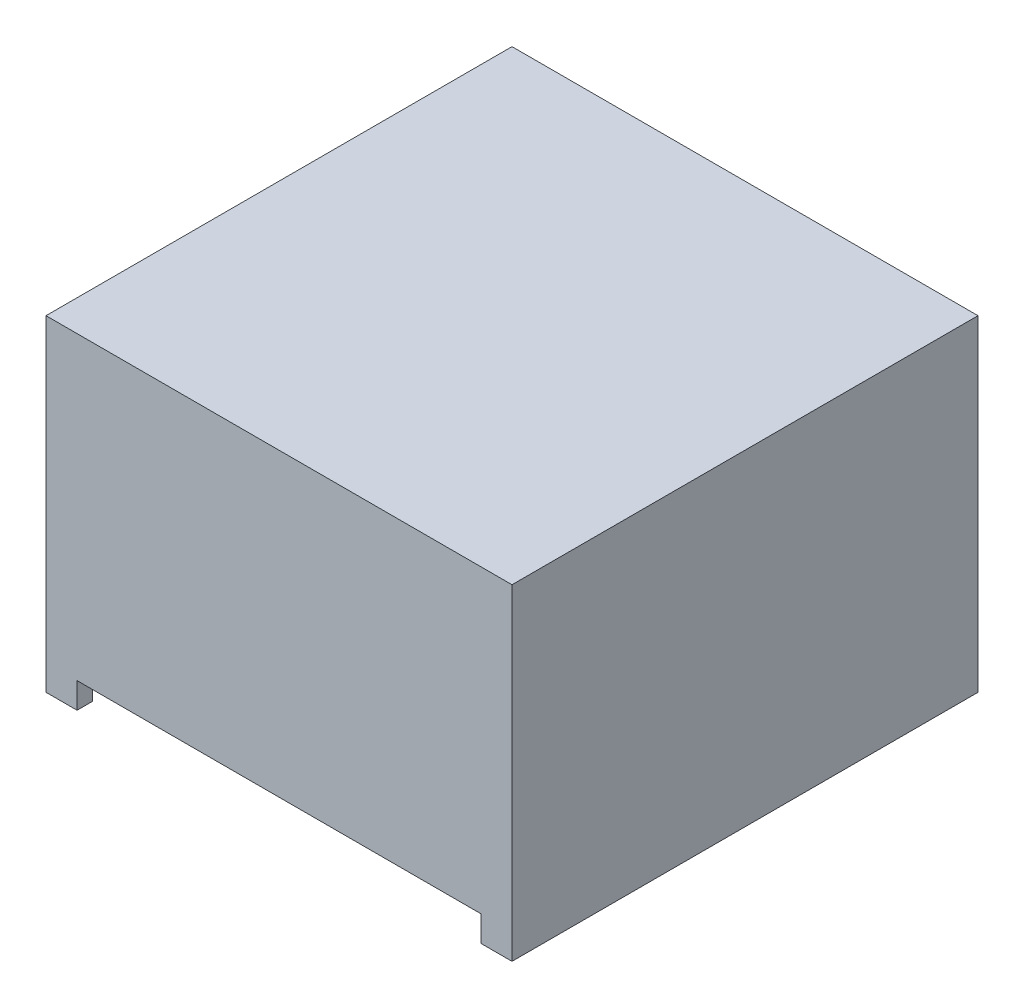
ISO-10303-21;
HEADER;
FILE_DESCRIPTION(('STEP AP214'),'2;1');
FILE_NAME('part.step','',(''),(''),'','','');
FILE_SCHEMA(('AUTOMOTIVE_DESIGN { 1 0 10303 214 1 1 1 1 }'));
ENDSEC;
DATA;
#1=APPLICATION_CONTEXT('core data for automotive mechanical design processes');
#2=APPLICATION_PROTOCOL_DEFINITION('international standard','automotive_design',2000,#1);
#3=PRODUCT_CONTEXT('',#1,'mechanical');
#4=PRODUCT('Part','Part','',(#3));
#5=PRODUCT_RELATED_PRODUCT_CATEGORY('part','',(#4));
#6=PRODUCT_DEFINITION_FORMATION('','',#4);
#7=PRODUCT_DEFINITION_CONTEXT('part definition',#1,'design');
#8=PRODUCT_DEFINITION('design','',#6,#7);
#9=PRODUCT_DEFINITION_SHAPE('','',#8);
#10=(LENGTH_UNIT() NAMED_UNIT(*) SI_UNIT(.MILLI.,.METRE.));
#11=(NAMED_UNIT(*) PLANE_ANGLE_UNIT() SI_UNIT($,.RADIAN.));
#12=(NAMED_UNIT(*) SI_UNIT($,.STERADIAN.) SOLID_ANGLE_UNIT());
#13=UNCERTAINTY_MEASURE_WITH_UNIT(LENGTH_MEASURE(1.E-05),#10,'distance_accuracy_value','');
#14=(GEOMETRIC_REPRESENTATION_CONTEXT(3) GLOBAL_UNCERTAINTY_ASSIGNED_CONTEXT((#13)) GLOBAL_UNIT_ASSIGNED_CONTEXT((#10,
#11,#12)) REPRESENTATION_CONTEXT('',''));
#15=CARTESIAN_POINT('',(0.,0.,0.));
#16=DIRECTION('',(0.,0.,1.));
#17=DIRECTION('',(1.,0.,0.));
#18=AXIS2_PLACEMENT_3D('',#15,#16,#17);
#19=CARTESIAN_POINT('',(0.,5.,0.));
#20=DIRECTION('',(1.,0.,0.));
#21=DIRECTION('',(0.,0.,-1.));
#22=AXIS2_PLACEMENT_3D('',#19,#20,#21);
#23=PLANE('',#22);
#24=DIRECTION('',(0.,-1.,0.));
#25=VECTOR('',#24,1.);
#26=CARTESIAN_POINT('',(0.,5.,150.));
#27=LINE('',#26,#25);
#28=CARTESIAN_POINT('',(0.,5.,150.));
#29=VERTEX_POINT('',#28);
#30=CARTESIAN_POINT('',(0.,-100.,150.));
#31=VERTEX_POINT('',#30);
#32=EDGE_CURVE('E38',#29,#31,#27,.T.);
#33=ORIENTED_EDGE('',*,*,#32,.T.);
#34=DIRECTION('',(0.,0.,-1.));
#35=VECTOR('',#34,1.);
#36=CARTESIAN_POINT('',(0.,-100.,0.));
#37=LINE('',#36,#35);
#38=CARTESIAN_POINT('',(0.,-100.,0.));
#39=VERTEX_POINT('',#38);
#40=EDGE_CURVE('E170',#31,#39,#37,.T.);
#41=ORIENTED_EDGE('',*,*,#40,.T.);
#42=DIRECTION('',(0.,-1.,0.));
#43=VECTOR('',#42,1.);
#44=CARTESIAN_POINT('',(0.,5.,0.));
#45=LINE('',#44,#43);
#46=CARTESIAN_POINT('',(0.,5.,0.));
#47=VERTEX_POINT('',#46);
#48=EDGE_CURVE('E11',#47,#39,#45,.T.);
#49=ORIENTED_EDGE('',*,*,#48,.F.);
#50=DIRECTION('',(0.,0.,1.));
#51=VECTOR('',#50,1.);
#52=CARTESIAN_POINT('',(0.,5.,0.));
#53=LINE('',#52,#51);
#54=EDGE_CURVE('E185',#47,#29,#53,.T.);
#55=ORIENTED_EDGE('',*,*,#54,.T.);
#56=EDGE_LOOP('',(#33,#41,#49,#55));
#57=FACE_BOUND('',#56,.T.);
#58=ADVANCED_FACE('F35',(#57),#23,.T.);
#59=CARTESIAN_POINT('',(0.,5.,0.));
#60=DIRECTION('',(0.,0.,1.));
#61=DIRECTION('',(1.,0.,0.));
#62=AXIS2_PLACEMENT_3D('',#59,#60,#61);
#63=PLANE('',#62);
#64=ORIENTED_EDGE('',*,*,#48,.T.);
#65=DIRECTION('',(-1.,0.,0.));
#66=VECTOR('',#65,1.);
#67=CARTESIAN_POINT('',(0.,-100.,0.));
#68=LINE('',#67,#66);
#69=CARTESIAN_POINT('',(-150.,-100.,0.));
#70=VERTEX_POINT('',#69);
#71=EDGE_CURVE('E176',#39,#70,#68,.T.);
#72=ORIENTED_EDGE('',*,*,#71,.T.);
#73=DIRECTION('',(0.,-1.,0.));
#74=VECTOR('',#73,1.);
#75=CARTESIAN_POINT('',(-150.,5.,0.));
#76=LINE('',#75,#74);
#77=CARTESIAN_POINT('',(-150.,5.,0.));
#78=VERTEX_POINT('',#77);
#79=EDGE_CURVE('E43',#78,#70,#76,.T.);
#80=ORIENTED_EDGE('',*,*,#79,.F.);
#81=DIRECTION('',(-1.,0.,0.));
#82=VECTOR('',#81,1.);
#83=CARTESIAN_POINT('',(0.,5.,0.));
#84=LINE('',#83,#82);
#85=EDGE_CURVE('E193',#47,#78,#84,.T.);
#86=ORIENTED_EDGE('',*,*,#85,.F.);
#87=EDGE_LOOP('',(#64,#72,#80,#86));
#88=FACE_BOUND('',#87,.T.);
#89=ADVANCED_FACE('F209',(#88),#63,.F.);
#90=CARTESIAN_POINT('',(-150.,5.,0.));
#91=DIRECTION('',(1.,0.,0.));
#92=DIRECTION('',(0.,0.,-1.));
#93=AXIS2_PLACEMENT_3D('',#90,#91,#92);
#94=PLANE('',#93);
#95=ORIENTED_EDGE('',*,*,#79,.T.);
#96=DIRECTION('',(0.,0.,1.));
#97=VECTOR('',#96,1.);
#98=CARTESIAN_POINT('',(-150.,-100.,0.));
#99=LINE('',#98,#97);
#100=CARTESIAN_POINT('',(-150.,-100.,150.));
#101=VERTEX_POINT('',#100);
#102=EDGE_CURVE('E179',#70,#101,#99,.T.);
#103=ORIENTED_EDGE('',*,*,#102,.T.);
#104=DIRECTION('',(0.,-1.,0.));
#105=VECTOR('',#104,1.);
#106=CARTESIAN_POINT('',(-150.,5.,150.));
#107=LINE('',#106,#105);
#108=CARTESIAN_POINT('',(-150.,5.,150.));
#109=VERTEX_POINT('',#108);
#110=EDGE_CURVE('E195',#109,#101,#107,.T.);
#111=ORIENTED_EDGE('',*,*,#110,.F.);
#112=DIRECTION('',(0.,0.,1.));
#113=VECTOR('',#112,1.);
#114=CARTESIAN_POINT('',(-150.,5.,0.));
#115=LINE('',#114,#113);
#116=EDGE_CURVE('E191',#78,#109,#115,.T.);
#117=ORIENTED_EDGE('',*,*,#116,.F.);
#118=EDGE_LOOP('',(#95,#103,#111,#117));
#119=FACE_BOUND('',#118,.T.);
#120=ADVANCED_FACE('F217',(#119),#94,.F.);
#121=CARTESIAN_POINT('',(0.,5.,150.));
#122=DIRECTION('',(0.,0.,1.));
#123=DIRECTION('',(1.,0.,0.));
#124=AXIS2_PLACEMENT_3D('',#121,#122,#123);
#125=PLANE('',#124);
#126=DIRECTION('',(0.,-1.,0.));
#127=VECTOR('',#126,1.);
#128=CARTESIAN_POINT('',(-140.,-100.,150.));
#129=LINE('',#128,#127);
#130=CARTESIAN_POINT('',(-140.,-91.7339563952613,150.));
#131=VERTEX_POINT('',#130);
#132=CARTESIAN_POINT('',(-140.,-100.,150.));
#133=VERTEX_POINT('',#132);
#134=EDGE_CURVE('E130',#131,#133,#129,.T.);
#135=ORIENTED_EDGE('',*,*,#134,.F.);
#136=DIRECTION('',(-1.,0.,0.));
#137=VECTOR('',#136,1.);
#138=CARTESIAN_POINT('',(-140.,-91.7339563952613,150.));
#139=LINE('',#138,#137);
#140=CARTESIAN_POINT('',(-10.,-91.7339563952613,150.));
#141=VERTEX_POINT('',#140);
#142=EDGE_CURVE('E144',#141,#131,#139,.T.);
#143=ORIENTED_EDGE('',*,*,#142,.F.);
#144=DIRECTION('',(0.,1.,0.));
#145=VECTOR('',#144,1.);
#146=CARTESIAN_POINT('',(-10.,-100.,150.));
#147=LINE('',#146,#145);
#148=CARTESIAN_POINT('',(-10.,-100.,150.));
#149=VERTEX_POINT('',#148);
#150=EDGE_CURVE('E266',#149,#141,#147,.T.);
#151=ORIENTED_EDGE('',*,*,#150,.F.);
#152=DIRECTION('',(1.,0.,0.));
#153=VECTOR('',#152,1.);
#154=CARTESIAN_POINT('',(0.,-100.,150.));
#155=LINE('',#154,#153);
#156=EDGE_CURVE('E182',#149,#31,#155,.T.);
#157=ORIENTED_EDGE('',*,*,#156,.T.);
#158=ORIENTED_EDGE('',*,*,#32,.F.);
#159=DIRECTION('',(-1.,0.,0.));
#160=VECTOR('',#159,1.);
#161=CARTESIAN_POINT('',(0.,5.,150.));
#162=LINE('',#161,#160);
#163=EDGE_CURVE('E188',#29,#109,#162,.T.);
#164=ORIENTED_EDGE('',*,*,#163,.T.);
#165=ORIENTED_EDGE('',*,*,#110,.T.);
#166=EDGE_CURVE('E183',#101,#133,#155,.T.);
#167=ORIENTED_EDGE('',*,*,#166,.T.);
#168=EDGE_LOOP('',(#135,#143,#151,#157,#158,#164,#165,#167));
#169=FACE_BOUND('',#168,.T.);
#170=ADVANCED_FACE('F214',(#169),#125,.T.);
#171=CARTESIAN_POINT('',(0.,5.,0.));
#172=DIRECTION('',(0.,-1.,0.));
#173=DIRECTION('',(0.,0.,-1.));
#174=AXIS2_PLACEMENT_3D('',#171,#172,#173);
#175=PLANE('',#174);
#176=ORIENTED_EDGE('',*,*,#54,.F.);
#177=ORIENTED_EDGE('',*,*,#85,.T.);
#178=ORIENTED_EDGE('',*,*,#116,.T.);
#179=ORIENTED_EDGE('',*,*,#163,.F.);
#180=EDGE_LOOP('',(#176,#177,#178,#179));
#181=FACE_BOUND('',#180,.T.);
#182=ADVANCED_FACE('F213',(#181),#175,.F.);
#183=CARTESIAN_POINT('',(0.,-100.,0.));
#184=DIRECTION('',(0.,-1.,0.));
#185=DIRECTION('',(0.,0.,-1.));
#186=AXIS2_PLACEMENT_3D('',#183,#184,#185);
#187=PLANE('',#186);
#188=DIRECTION('',(0.,0.,1.));
#189=VECTOR('',#188,1.);
#190=CARTESIAN_POINT('',(-140.,-100.,145.));
#191=LINE('',#190,#189);
#192=CARTESIAN_POINT('',(-140.,-100.,145.));
#193=VERTEX_POINT('',#192);
#194=EDGE_CURVE('E125',#193,#133,#191,.T.);
#195=ORIENTED_EDGE('',*,*,#194,.T.);
#196=ORIENTED_EDGE('',*,*,#166,.F.);
#197=ORIENTED_EDGE('',*,*,#102,.F.);
#198=ORIENTED_EDGE('',*,*,#71,.F.);
#199=ORIENTED_EDGE('',*,*,#40,.F.);
#200=ORIENTED_EDGE('',*,*,#156,.F.);
#201=DIRECTION('',(0.,0.,1.));
#202=VECTOR('',#201,1.);
#203=CARTESIAN_POINT('',(-10.,-100.,145.));
#204=LINE('',#203,#202);
#205=CARTESIAN_POINT('',(-10.,-100.,145.));
#206=VERTEX_POINT('',#205);
#207=EDGE_CURVE('E135',#206,#149,#204,.T.);
#208=ORIENTED_EDGE('',*,*,#207,.F.);
#209=DIRECTION('',(1.,0.,0.));
#210=VECTOR('',#209,1.);
#211=CARTESIAN_POINT('',(-4.99999999999998,-100.,145.));
#212=LINE('',#211,#210);
#213=CARTESIAN_POINT('',(-4.99999999999998,-100.,145.));
#214=VERTEX_POINT('',#213);
#215=EDGE_CURVE('E149',#206,#214,#212,.T.);
#216=ORIENTED_EDGE('',*,*,#215,.T.);
#217=DIRECTION('',(0.,0.,-1.));
#218=VECTOR('',#217,1.);
#219=CARTESIAN_POINT('',(-5.,-100.,5.));
#220=LINE('',#219,#218);
#221=CARTESIAN_POINT('',(-5.,-100.,5.));
#222=VERTEX_POINT('',#221);
#223=EDGE_CURVE('E167',#214,#222,#220,.T.);
#224=ORIENTED_EDGE('',*,*,#223,.T.);
#225=DIRECTION('',(-1.,0.,0.));
#226=VECTOR('',#225,1.);
#227=CARTESIAN_POINT('',(-5.,-100.,5.));
#228=LINE('',#227,#226);
#229=CARTESIAN_POINT('',(-145.,-100.,5.00000000000002));
#230=VERTEX_POINT('',#229);
#231=EDGE_CURVE('E275',#222,#230,#228,.T.);
#232=ORIENTED_EDGE('',*,*,#231,.T.);
#233=DIRECTION('',(0.,0.,1.));
#234=VECTOR('',#233,1.);
#235=CARTESIAN_POINT('',(-145.,-100.,5.00000000000002));
#236=LINE('',#235,#234);
#237=CARTESIAN_POINT('',(-145.,-100.,145.));
#238=VERTEX_POINT('',#237);
#239=EDGE_CURVE('E148',#230,#238,#236,.T.);
#240=ORIENTED_EDGE('',*,*,#239,.T.);
#241=EDGE_CURVE('E140',#238,#193,#212,.T.);
#242=ORIENTED_EDGE('',*,*,#241,.T.);
#243=EDGE_LOOP('',(#195,#196,#197,#198,#199,#200,#208,#216,#224,#232,#240,#242));
#244=FACE_BOUND('',#243,.T.);
#245=ADVANCED_FACE('F146',(#244),#187,.T.);
#246=CARTESIAN_POINT('',(-5.,-100.,5.));
#247=DIRECTION('',(1.,0.,0.));
#248=DIRECTION('',(0.,0.,-1.));
#249=AXIS2_PLACEMENT_3D('',#246,#247,#248);
#250=PLANE('',#249);
#251=DIRECTION('',(0.,0.,-1.));
#252=VECTOR('',#251,1.);
#253=CARTESIAN_POINT('',(-5.,0.,5.));
#254=LINE('',#253,#252);
#255=CARTESIAN_POINT('',(-4.99999999999998,0.,145.));
#256=VERTEX_POINT('',#255);
#257=CARTESIAN_POINT('',(-5.,0.,5.));
#258=VERTEX_POINT('',#257);
#259=EDGE_CURVE('E156',#256,#258,#254,.T.);
#260=ORIENTED_EDGE('',*,*,#259,.T.);
#261=DIRECTION('',(0.,1.,0.));
#262=VECTOR('',#261,1.);
#263=CARTESIAN_POINT('',(-5.,-100.,5.));
#264=LINE('',#263,#262);
#265=EDGE_CURVE('E59',#222,#258,#264,.T.);
#266=ORIENTED_EDGE('',*,*,#265,.F.);
#267=ORIENTED_EDGE('',*,*,#223,.F.);
#268=DIRECTION('',(0.,1.,0.));
#269=VECTOR('',#268,1.);
#270=CARTESIAN_POINT('',(-4.99999999999998,-100.,145.));
#271=LINE('',#270,#269);
#272=EDGE_CURVE('E168',#214,#256,#271,.T.);
#273=ORIENTED_EDGE('',*,*,#272,.T.);
#274=EDGE_LOOP('',(#260,#266,#267,#273));
#275=FACE_BOUND('',#274,.T.);
#276=ADVANCED_FACE('F240',(#275),#250,.F.);
#277=CARTESIAN_POINT('',(-4.99999999999998,-100.,145.));
#278=DIRECTION('',(0.,0.,1.));
#279=DIRECTION('',(1.,0.,0.));
#280=AXIS2_PLACEMENT_3D('',#277,#278,#279);
#281=PLANE('',#280);
#282=DIRECTION('',(-1.,0.,0.));
#283=VECTOR('',#282,1.);
#284=CARTESIAN_POINT('',(-140.,-91.7339563952613,145.));
#285=LINE('',#284,#283);
#286=CARTESIAN_POINT('',(-10.,-91.7339563952613,145.));
#287=VERTEX_POINT('',#286);
#288=CARTESIAN_POINT('',(-140.,-91.7339563952613,145.));
#289=VERTEX_POINT('',#288);
#290=EDGE_CURVE('E51',#287,#289,#285,.T.);
#291=ORIENTED_EDGE('',*,*,#290,.T.);
#292=DIRECTION('',(0.,-1.,0.));
#293=VECTOR('',#292,1.);
#294=CARTESIAN_POINT('',(-140.,-100.,145.));
#295=LINE('',#294,#293);
#296=EDGE_CURVE('E128',#289,#193,#295,.T.);
#297=ORIENTED_EDGE('',*,*,#296,.T.);
#298=ORIENTED_EDGE('',*,*,#241,.F.);
#299=DIRECTION('',(0.,1.,0.));
#300=VECTOR('',#299,1.);
#301=CARTESIAN_POINT('',(-145.,-100.,145.));
#302=LINE('',#301,#300);
#303=CARTESIAN_POINT('',(-145.,0.,145.));
#304=VERTEX_POINT('',#303);
#305=EDGE_CURVE('E171',#238,#304,#302,.T.);
#306=ORIENTED_EDGE('',*,*,#305,.T.);
#307=DIRECTION('',(1.,0.,0.));
#308=VECTOR('',#307,1.);
#309=CARTESIAN_POINT('',(-4.99999999999998,0.,145.));
#310=LINE('',#309,#308);
#311=EDGE_CURVE('E164',#304,#256,#310,.T.);
#312=ORIENTED_EDGE('',*,*,#311,.T.);
#313=ORIENTED_EDGE('',*,*,#272,.F.);
#314=ORIENTED_EDGE('',*,*,#215,.F.);
#315=DIRECTION('',(0.,1.,0.));
#316=VECTOR('',#315,1.);
#317=CARTESIAN_POINT('',(-10.,-100.,145.));
#318=LINE('',#317,#316);
#319=EDGE_CURVE('E143',#206,#287,#318,.T.);
#320=ORIENTED_EDGE('',*,*,#319,.T.);
#321=EDGE_LOOP('',(#291,#297,#298,#306,#312,#313,#314,#320));
#322=FACE_BOUND('',#321,.T.);
#323=ADVANCED_FACE('F139',(#322),#281,.F.);
#324=CARTESIAN_POINT('',(-145.,-100.,5.00000000000002));
#325=DIRECTION('',(-1.,0.,0.));
#326=DIRECTION('',(0.,0.,1.));
#327=AXIS2_PLACEMENT_3D('',#324,#325,#326);
#328=PLANE('',#327);
#329=DIRECTION('',(0.,0.,1.));
#330=VECTOR('',#329,1.);
#331=CARTESIAN_POINT('',(-145.,0.,5.00000000000002));
#332=LINE('',#331,#330);
#333=CARTESIAN_POINT('',(-145.,0.,5.00000000000002));
#334=VERTEX_POINT('',#333);
#335=EDGE_CURVE('E161',#334,#304,#332,.T.);
#336=ORIENTED_EDGE('',*,*,#335,.T.);
#337=ORIENTED_EDGE('',*,*,#305,.F.);
#338=ORIENTED_EDGE('',*,*,#239,.F.);
#339=DIRECTION('',(0.,1.,0.));
#340=VECTOR('',#339,1.);
#341=CARTESIAN_POINT('',(-145.,-100.,5.00000000000002));
#342=LINE('',#341,#340);
#343=EDGE_CURVE('E151',#230,#334,#342,.T.);
#344=ORIENTED_EDGE('',*,*,#343,.T.);
#345=EDGE_LOOP('',(#336,#337,#338,#344));
#346=FACE_BOUND('',#345,.T.);
#347=ADVANCED_FACE('F246',(#346),#328,.F.);
#348=CARTESIAN_POINT('',(-5.,-100.,5.));
#349=DIRECTION('',(0.,0.,-1.));
#350=DIRECTION('',(-1.,0.,0.));
#351=AXIS2_PLACEMENT_3D('',#348,#349,#350);
#352=PLANE('',#351);
#353=DIRECTION('',(-1.,0.,0.));
#354=VECTOR('',#353,1.);
#355=CARTESIAN_POINT('',(-5.,0.,5.));
#356=LINE('',#355,#354);
#357=EDGE_CURVE('E158',#258,#334,#356,.T.);
#358=ORIENTED_EDGE('',*,*,#357,.T.);
#359=ORIENTED_EDGE('',*,*,#343,.F.);
#360=ORIENTED_EDGE('',*,*,#231,.F.);
#361=ORIENTED_EDGE('',*,*,#265,.T.);
#362=EDGE_LOOP('',(#358,#359,#360,#361));
#363=FACE_BOUND('',#362,.T.);
#364=ADVANCED_FACE('F235',(#363),#352,.F.);
#365=CARTESIAN_POINT('',(0.,0.,0.));
#366=DIRECTION('',(0.,-1.,0.));
#367=DIRECTION('',(0.,0.,-1.));
#368=AXIS2_PLACEMENT_3D('',#365,#366,#367);
#369=PLANE('',#368);
#370=ORIENTED_EDGE('',*,*,#357,.F.);
#371=ORIENTED_EDGE('',*,*,#259,.F.);
#372=ORIENTED_EDGE('',*,*,#311,.F.);
#373=ORIENTED_EDGE('',*,*,#335,.F.);
#374=EDGE_LOOP('',(#370,#371,#372,#373));
#375=FACE_BOUND('',#374,.T.);
#376=ADVANCED_FACE('F233',(#375),#369,.T.);
#377=CARTESIAN_POINT('',(-140.,-100.,145.));
#378=DIRECTION('',(-1.,0.,0.));
#379=DIRECTION('',(0.,0.,1.));
#380=AXIS2_PLACEMENT_3D('',#377,#378,#379);
#381=PLANE('',#380);
#382=ORIENTED_EDGE('',*,*,#134,.T.);
#383=ORIENTED_EDGE('',*,*,#194,.F.);
#384=ORIENTED_EDGE('',*,*,#296,.F.);
#385=DIRECTION('',(0.,0.,1.));
#386=VECTOR('',#385,1.);
#387=CARTESIAN_POINT('',(-140.,-91.7339563952613,145.));
#388=LINE('',#387,#386);
#389=EDGE_CURVE('E159',#289,#131,#388,.T.);
#390=ORIENTED_EDGE('',*,*,#389,.T.);
#391=EDGE_LOOP('',(#382,#383,#384,#390));
#392=FACE_BOUND('',#391,.T.);
#393=ADVANCED_FACE('F127',(#392),#381,.F.);
#394=CARTESIAN_POINT('',(-140.,-91.7339563952613,145.));
#395=DIRECTION('',(0.,1.,0.));
#396=DIRECTION('',(0.,0.,1.));
#397=AXIS2_PLACEMENT_3D('',#394,#395,#396);
#398=PLANE('',#397);
#399=ORIENTED_EDGE('',*,*,#142,.T.);
#400=ORIENTED_EDGE('',*,*,#389,.F.);
#401=ORIENTED_EDGE('',*,*,#290,.F.);
#402=DIRECTION('',(0.,0.,1.));
#403=VECTOR('',#402,1.);
#404=CARTESIAN_POINT('',(-10.,-91.7339563952613,145.));
#405=LINE('',#404,#403);
#406=EDGE_CURVE('E263',#287,#141,#405,.T.);
#407=ORIENTED_EDGE('',*,*,#406,.T.);
#408=EDGE_LOOP('',(#399,#400,#401,#407));
#409=FACE_BOUND('',#408,.T.);
#410=ADVANCED_FACE('F254',(#409),#398,.F.);
#411=CARTESIAN_POINT('',(-10.,-100.,145.));
#412=DIRECTION('',(1.,0.,0.));
#413=DIRECTION('',(0.,0.,-1.));
#414=AXIS2_PLACEMENT_3D('',#411,#412,#413);
#415=PLANE('',#414);
#416=ORIENTED_EDGE('',*,*,#150,.T.);
#417=ORIENTED_EDGE('',*,*,#406,.F.);
#418=ORIENTED_EDGE('',*,*,#319,.F.);
#419=ORIENTED_EDGE('',*,*,#207,.T.);
#420=EDGE_LOOP('',(#416,#417,#418,#419));
#421=FACE_BOUND('',#420,.T.);
#422=ADVANCED_FACE('F255',(#421),#415,.F.);
#423=CLOSED_SHELL('',(#58,#89,#120,#170,#182,#245,#276,#323,#347,#364,#376,#393,#410,#422));
#424=MANIFOLD_SOLID_BREP('B2',#423);
#425=ADVANCED_BREP_SHAPE_REPRESENTATION('',(#18,#424),#14);
#426=SHAPE_DEFINITION_REPRESENTATION(#9,#425);
ENDSEC;
END-ISO-10303-21;
